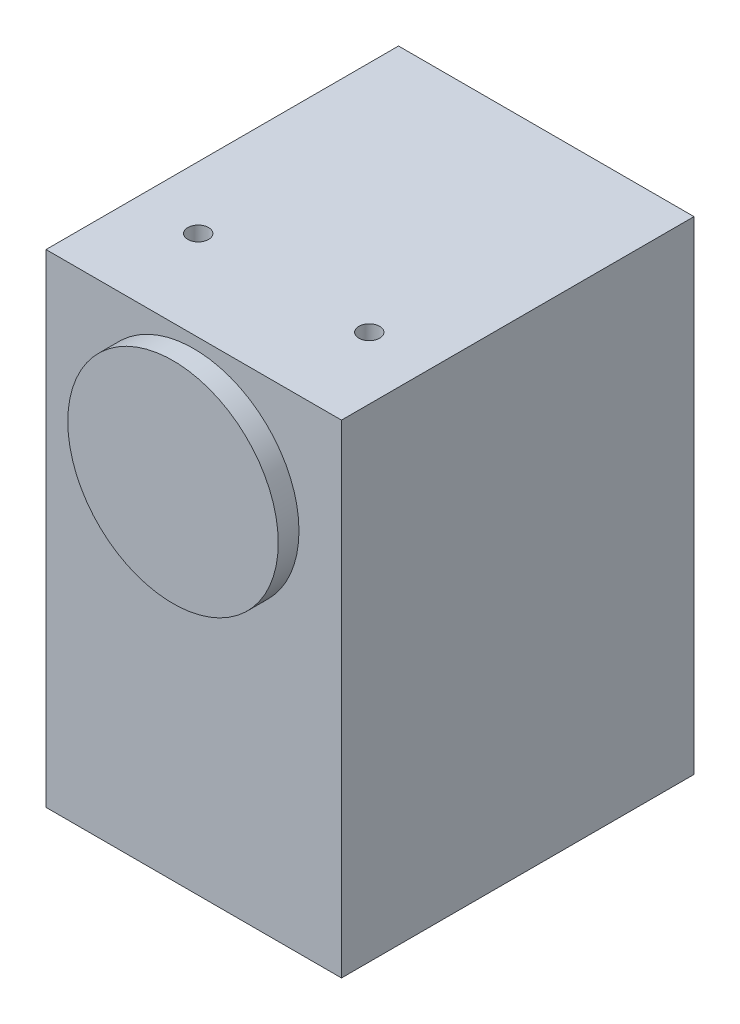
ISO-10303-21;
HEADER;
FILE_DESCRIPTION(('STEP AP214'),'2;1');
FILE_NAME('part.step','',(''),(''),'','','');
FILE_SCHEMA(('AUTOMOTIVE_DESIGN { 1 0 10303 214 1 1 1 1 }'));
ENDSEC;
DATA;
#1=APPLICATION_CONTEXT('core data for automotive mechanical design processes');
#2=APPLICATION_PROTOCOL_DEFINITION('international standard','automotive_design',2000,#1);
#3=PRODUCT_CONTEXT('',#1,'mechanical');
#4=PRODUCT('Part','Part','',(#3));
#5=PRODUCT_RELATED_PRODUCT_CATEGORY('part','',(#4));
#6=PRODUCT_DEFINITION_FORMATION('','',#4);
#7=PRODUCT_DEFINITION_CONTEXT('part definition',#1,'design');
#8=PRODUCT_DEFINITION('design','',#6,#7);
#9=PRODUCT_DEFINITION_SHAPE('','',#8);
#10=(LENGTH_UNIT() NAMED_UNIT(*) SI_UNIT(.MILLI.,.METRE.));
#11=(NAMED_UNIT(*) PLANE_ANGLE_UNIT() SI_UNIT($,.RADIAN.));
#12=(NAMED_UNIT(*) SI_UNIT($,.STERADIAN.) SOLID_ANGLE_UNIT());
#13=UNCERTAINTY_MEASURE_WITH_UNIT(LENGTH_MEASURE(1.E-05),#10,'distance_accuracy_value','');
#14=(GEOMETRIC_REPRESENTATION_CONTEXT(3) GLOBAL_UNCERTAINTY_ASSIGNED_CONTEXT((#13)) GLOBAL_UNIT_ASSIGNED_CONTEXT((#10,
#11,#12)) REPRESENTATION_CONTEXT('',''));
#15=CARTESIAN_POINT('',(0.,0.,0.));
#16=DIRECTION('',(0.,0.,1.));
#17=DIRECTION('',(1.,0.,0.));
#18=AXIS2_PLACEMENT_3D('',#15,#16,#17);
#19=CARTESIAN_POINT('',(14.25,-23.3,34.));
#20=DIRECTION('',(-1.,0.,0.));
#21=DIRECTION('',(0.,0.,1.));
#22=AXIS2_PLACEMENT_3D('',#19,#20,#21);
#23=PLANE('',#22);
#24=DIRECTION('',(0.,1.,0.));
#25=VECTOR('',#24,1.);
#26=CARTESIAN_POINT('',(14.25,-23.3,0.));
#27=LINE('',#26,#25);
#28=CARTESIAN_POINT('',(14.25,-23.3,0.));
#29=VERTEX_POINT('',#28);
#30=CARTESIAN_POINT('',(14.25,23.3,0.));
#31=VERTEX_POINT('',#30);
#32=EDGE_CURVE('E99',#29,#31,#27,.T.);
#33=ORIENTED_EDGE('',*,*,#32,.T.);
#34=DIRECTION('',(0.,0.,-1.));
#35=VECTOR('',#34,1.);
#36=CARTESIAN_POINT('',(14.25,23.3,34.));
#37=LINE('',#36,#35);
#38=CARTESIAN_POINT('',(14.25,23.3,34.));
#39=VERTEX_POINT('',#38);
#40=EDGE_CURVE('E36',#39,#31,#37,.T.);
#41=ORIENTED_EDGE('',*,*,#40,.F.);
#42=DIRECTION('',(0.,1.,0.));
#43=VECTOR('',#42,1.);
#44=CARTESIAN_POINT('',(14.25,-23.3,34.));
#45=LINE('',#44,#43);
#46=CARTESIAN_POINT('',(14.25,-23.3,34.));
#47=VERTEX_POINT('',#46);
#48=EDGE_CURVE('E86',#47,#39,#45,.T.);
#49=ORIENTED_EDGE('',*,*,#48,.F.);
#50=DIRECTION('',(0.,0.,-1.));
#51=VECTOR('',#50,1.);
#52=CARTESIAN_POINT('',(14.25,-23.3,34.));
#53=LINE('',#52,#51);
#54=EDGE_CURVE('E95',#47,#29,#53,.T.);
#55=ORIENTED_EDGE('',*,*,#54,.T.);
#56=EDGE_LOOP('',(#33,#41,#49,#55));
#57=FACE_BOUND('',#56,.T.);
#58=ADVANCED_FACE('F33',(#57),#23,.F.);
#59=CARTESIAN_POINT('',(-14.25,23.3,34.));
#60=DIRECTION('',(0.,-1.,0.));
#61=DIRECTION('',(0.,0.,-1.));
#62=AXIS2_PLACEMENT_3D('',#59,#60,#61);
#63=PLANE('',#62);
#64=CARTESIAN_POINT('',(-8.24999999999999,23.3,25.3193900829955));
#65=DIRECTION('',(0.,1.,0.));
#66=DIRECTION('',(0.,0.,1.));
#67=AXIS2_PLACEMENT_3D('',#64,#65,#66);
#68=CIRCLE('',#67,1.);
#69=CARTESIAN_POINT('',(-8.24999999999999,23.3,26.3193900829955));
#70=VERTEX_POINT('',#69);
#71=EDGE_CURVE('E122',#70,#70,#68,.T.);
#72=ORIENTED_EDGE('',*,*,#71,.F.);
#73=EDGE_LOOP('',(#72));
#74=FACE_BOUND('',#73,.T.);
#75=CARTESIAN_POINT('',(8.25000000000001,23.3,25.3193900829955));
#76=DIRECTION('',(0.,1.,0.));
#77=DIRECTION('',(0.,0.,1.));
#78=AXIS2_PLACEMENT_3D('',#75,#76,#77);
#79=CIRCLE('',#78,1.);
#80=CARTESIAN_POINT('',(8.25000000000001,23.3,26.3193900829955));
#81=VERTEX_POINT('',#80);
#82=EDGE_CURVE('E116',#81,#81,#79,.T.);
#83=ORIENTED_EDGE('',*,*,#82,.F.);
#84=EDGE_LOOP('',(#83));
#85=FACE_BOUND('',#84,.T.);
#86=DIRECTION('',(-1.,0.,0.));
#87=VECTOR('',#86,1.);
#88=CARTESIAN_POINT('',(-14.25,23.3,0.));
#89=LINE('',#88,#87);
#90=CARTESIAN_POINT('',(-14.25,23.3,0.));
#91=VERTEX_POINT('',#90);
#92=EDGE_CURVE('E91',#31,#91,#89,.T.);
#93=ORIENTED_EDGE('',*,*,#92,.T.);
#94=DIRECTION('',(0.,0.,-1.));
#95=VECTOR('',#94,1.);
#96=CARTESIAN_POINT('',(-14.25,23.3,34.));
#97=LINE('',#96,#95);
#98=CARTESIAN_POINT('',(-14.25,23.3,34.));
#99=VERTEX_POINT('',#98);
#100=EDGE_CURVE('E89',#99,#91,#97,.T.);
#101=ORIENTED_EDGE('',*,*,#100,.F.);
#102=DIRECTION('',(-1.,0.,0.));
#103=VECTOR('',#102,1.);
#104=CARTESIAN_POINT('',(-14.25,23.3,34.));
#105=LINE('',#104,#103);
#106=EDGE_CURVE('E81',#39,#99,#105,.T.);
#107=ORIENTED_EDGE('',*,*,#106,.F.);
#108=ORIENTED_EDGE('',*,*,#40,.T.);
#109=EDGE_LOOP('',(#93,#101,#107,#108));
#110=FACE_BOUND('',#109,.T.);
#111=ADVANCED_FACE('F90',(#74,#85,#110),#63,.F.);
#112=CARTESIAN_POINT('',(-14.25,-23.3,34.));
#113=DIRECTION('',(1.,0.,0.));
#114=DIRECTION('',(0.,0.,-1.));
#115=AXIS2_PLACEMENT_3D('',#112,#113,#114);
#116=PLANE('',#115);
#117=DIRECTION('',(0.,-1.,0.));
#118=VECTOR('',#117,1.);
#119=CARTESIAN_POINT('',(-14.25,-23.3,0.));
#120=LINE('',#119,#118);
#121=CARTESIAN_POINT('',(-14.25,-23.3,0.));
#122=VERTEX_POINT('',#121);
#123=EDGE_CURVE('E67',#91,#122,#120,.T.);
#124=ORIENTED_EDGE('',*,*,#123,.T.);
#125=DIRECTION('',(0.,0.,-1.));
#126=VECTOR('',#125,1.);
#127=CARTESIAN_POINT('',(-14.25,-23.3,34.));
#128=LINE('',#127,#126);
#129=CARTESIAN_POINT('',(-14.25,-23.3,34.));
#130=VERTEX_POINT('',#129);
#131=EDGE_CURVE('E92',#130,#122,#128,.T.);
#132=ORIENTED_EDGE('',*,*,#131,.F.);
#133=DIRECTION('',(0.,-1.,0.));
#134=VECTOR('',#133,1.);
#135=CARTESIAN_POINT('',(-14.25,-23.3,34.));
#136=LINE('',#135,#134);
#137=EDGE_CURVE('E84',#99,#130,#136,.T.);
#138=ORIENTED_EDGE('',*,*,#137,.F.);
#139=ORIENTED_EDGE('',*,*,#100,.T.);
#140=EDGE_LOOP('',(#124,#132,#138,#139));
#141=FACE_BOUND('',#140,.T.);
#142=ADVANCED_FACE('F93',(#141),#116,.F.);
#143=CARTESIAN_POINT('',(-14.25,-23.3,34.));
#144=DIRECTION('',(0.,1.,0.));
#145=DIRECTION('',(0.,0.,1.));
#146=AXIS2_PLACEMENT_3D('',#143,#144,#145);
#147=PLANE('',#146);
#148=DIRECTION('',(1.,0.,0.));
#149=VECTOR('',#148,1.);
#150=CARTESIAN_POINT('',(-14.25,-23.3,0.));
#151=LINE('',#150,#149);
#152=EDGE_CURVE('E73',#122,#29,#151,.T.);
#153=ORIENTED_EDGE('',*,*,#152,.T.);
#154=ORIENTED_EDGE('',*,*,#54,.F.);
#155=DIRECTION('',(1.,0.,0.));
#156=VECTOR('',#155,1.);
#157=CARTESIAN_POINT('',(-14.25,-23.3,34.));
#158=LINE('',#157,#156);
#159=EDGE_CURVE('E50',#130,#47,#158,.T.);
#160=ORIENTED_EDGE('',*,*,#159,.F.);
#161=ORIENTED_EDGE('',*,*,#131,.T.);
#162=EDGE_LOOP('',(#153,#154,#160,#161));
#163=FACE_BOUND('',#162,.T.);
#164=ADVANCED_FACE('F107',(#163),#147,.F.);
#165=CARTESIAN_POINT('',(0.,0.,34.));
#166=DIRECTION('',(0.,0.,-1.));
#167=DIRECTION('',(-1.,0.,0.));
#168=AXIS2_PLACEMENT_3D('',#165,#166,#167);
#169=PLANE('',#168);
#170=CARTESIAN_POINT('',(0.,12.,34.));
#171=DIRECTION('',(0.,0.,1.));
#172=DIRECTION('',(1.,0.,0.));
#173=AXIS2_PLACEMENT_3D('',#170,#171,#172);
#174=CIRCLE('',#173,10.15);
#175=CARTESIAN_POINT('',(10.15,12.,34.));
#176=VERTEX_POINT('',#175);
#177=EDGE_CURVE('E11',#176,#176,#174,.T.);
#178=ORIENTED_EDGE('',*,*,#177,.F.);
#179=EDGE_LOOP('',(#178));
#180=FACE_BOUND('',#179,.T.);
#181=ORIENTED_EDGE('',*,*,#48,.T.);
#182=ORIENTED_EDGE('',*,*,#106,.T.);
#183=ORIENTED_EDGE('',*,*,#137,.T.);
#184=ORIENTED_EDGE('',*,*,#159,.T.);
#185=EDGE_LOOP('',(#181,#182,#183,#184));
#186=FACE_BOUND('',#185,.T.);
#187=ADVANCED_FACE('F82',(#180,#186),#169,.F.);
#188=CARTESIAN_POINT('',(0.,0.,0.));
#189=DIRECTION('',(0.,0.,-1.));
#190=DIRECTION('',(-1.,0.,0.));
#191=AXIS2_PLACEMENT_3D('',#188,#189,#190);
#192=PLANE('',#191);
#193=ORIENTED_EDGE('',*,*,#32,.F.);
#194=ORIENTED_EDGE('',*,*,#152,.F.);
#195=ORIENTED_EDGE('',*,*,#123,.F.);
#196=ORIENTED_EDGE('',*,*,#92,.F.);
#197=EDGE_LOOP('',(#193,#194,#195,#196));
#198=FACE_BOUND('',#197,.T.);
#199=ADVANCED_FACE('F110',(#198),#192,.T.);
#200=CARTESIAN_POINT('',(0.,12.,36.));
#201=DIRECTION('',(0.,0.,-1.));
#202=DIRECTION('',(-1.,0.,0.));
#203=AXIS2_PLACEMENT_3D('',#200,#201,#202);
#204=CYLINDRICAL_SURFACE('',#203,10.15);
#205=CARTESIAN_POINT('',(0.,12.,36.));
#206=DIRECTION('',(0.,0.,1.));
#207=DIRECTION('',(1.,0.,0.));
#208=AXIS2_PLACEMENT_3D('',#205,#206,#207);
#209=CIRCLE('',#208,10.15);
#210=CARTESIAN_POINT('',(10.15,12.,36.));
#211=VERTEX_POINT('',#210);
#212=EDGE_CURVE('E102',#211,#211,#209,.T.);
#213=ORIENTED_EDGE('',*,*,#212,.F.);
#214=EDGE_LOOP('',(#213));
#215=FACE_BOUND('',#214,.T.);
#216=ORIENTED_EDGE('',*,*,#177,.T.);
#217=EDGE_LOOP('',(#216));
#218=FACE_BOUND('',#217,.T.);
#219=ADVANCED_FACE('F152',(#215,#218),#204,.T.);
#220=CARTESIAN_POINT('',(0.,12.,36.));
#221=DIRECTION('',(0.,0.,1.));
#222=DIRECTION('',(1.,0.,0.));
#223=AXIS2_PLACEMENT_3D('',#220,#221,#222);
#224=PLANE('',#223);
#225=ORIENTED_EDGE('',*,*,#212,.T.);
#226=EDGE_LOOP('',(#225));
#227=FACE_BOUND('',#226,.T.);
#228=ADVANCED_FACE('F143',(#227),#224,.T.);
#229=CARTESIAN_POINT('',(8.25000000000001,21.3,25.3193900829955));
#230=DIRECTION('',(0.,1.,0.));
#231=DIRECTION('',(0.,0.,1.));
#232=AXIS2_PLACEMENT_3D('',#229,#230,#231);
#233=CYLINDRICAL_SURFACE('',#232,1.);
#234=CARTESIAN_POINT('',(8.25000000000001,21.3,25.3193900829955));
#235=DIRECTION('',(0.,1.,0.));
#236=DIRECTION('',(0.,0.,1.));
#237=AXIS2_PLACEMENT_3D('',#234,#235,#236);
#238=CIRCLE('',#237,1.);
#239=CARTESIAN_POINT('',(8.25000000000001,21.3,26.3193900829955));
#240=VERTEX_POINT('',#239);
#241=EDGE_CURVE('E119',#240,#240,#238,.T.);
#242=ORIENTED_EDGE('',*,*,#241,.F.);
#243=EDGE_LOOP('',(#242));
#244=FACE_BOUND('',#243,.T.);
#245=ORIENTED_EDGE('',*,*,#82,.T.);
#246=EDGE_LOOP('',(#245));
#247=FACE_BOUND('',#246,.T.);
#248=ADVANCED_FACE('F141',(#244,#247),#233,.F.);
#249=CARTESIAN_POINT('',(8.25000000000001,21.3,25.3193900829955));
#250=DIRECTION('',(0.,1.,0.));
#251=DIRECTION('',(0.,0.,1.));
#252=AXIS2_PLACEMENT_3D('',#249,#250,#251);
#253=PLANE('',#252);
#254=ORIENTED_EDGE('',*,*,#241,.T.);
#255=EDGE_LOOP('',(#254));
#256=FACE_BOUND('',#255,.T.);
#257=ADVANCED_FACE('F133',(#256),#253,.T.);
#258=CARTESIAN_POINT('',(-8.24999999999999,21.3,25.3193900829955));
#259=DIRECTION('',(0.,1.,0.));
#260=DIRECTION('',(0.,0.,1.));
#261=AXIS2_PLACEMENT_3D('',#258,#259,#260);
#262=CYLINDRICAL_SURFACE('',#261,1.);
#263=CARTESIAN_POINT('',(-8.24999999999999,21.3,25.3193900829955));
#264=DIRECTION('',(0.,1.,0.));
#265=DIRECTION('',(0.,0.,1.));
#266=AXIS2_PLACEMENT_3D('',#263,#264,#265);
#267=CIRCLE('',#266,1.);
#268=CARTESIAN_POINT('',(-8.24999999999999,21.3,26.3193900829955));
#269=VERTEX_POINT('',#268);
#270=EDGE_CURVE('E115',#269,#269,#267,.T.);
#271=ORIENTED_EDGE('',*,*,#270,.F.);
#272=EDGE_LOOP('',(#271));
#273=FACE_BOUND('',#272,.T.);
#274=ORIENTED_EDGE('',*,*,#71,.T.);
#275=EDGE_LOOP('',(#274));
#276=FACE_BOUND('',#275,.T.);
#277=ADVANCED_FACE('F130',(#273,#276),#262,.F.);
#278=CARTESIAN_POINT('',(-8.24999999999999,21.3,25.3193900829955));
#279=DIRECTION('',(0.,1.,0.));
#280=DIRECTION('',(0.,0.,1.));
#281=AXIS2_PLACEMENT_3D('',#278,#279,#280);
#282=PLANE('',#281);
#283=ORIENTED_EDGE('',*,*,#270,.T.);
#284=EDGE_LOOP('',(#283));
#285=FACE_BOUND('',#284,.T.);
#286=ADVANCED_FACE('F128',(#285),#282,.T.);
#287=CLOSED_SHELL('',(#58,#111,#142,#164,#187,#199,#219,#228,#248,#257,#277,#286));
#288=MANIFOLD_SOLID_BREP('B2',#287);
#289=ADVANCED_BREP_SHAPE_REPRESENTATION('',(#18,#288),#14);
#290=SHAPE_DEFINITION_REPRESENTATION(#9,#289);
ENDSEC;
END-ISO-10303-21;
